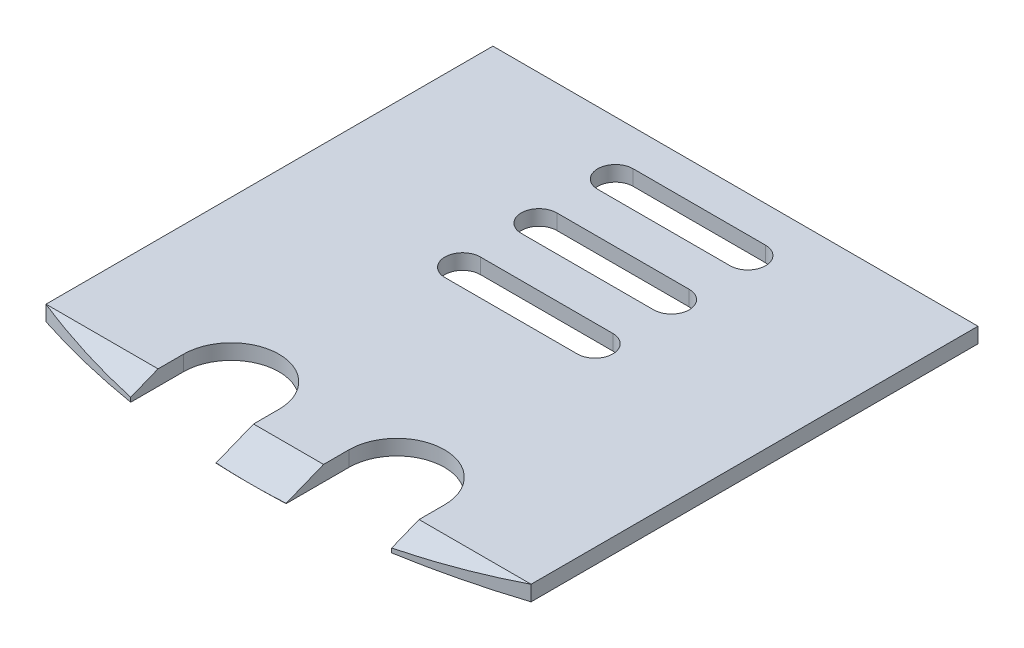
ISO-10303-21;
HEADER;
FILE_DESCRIPTION(('STEP AP214'),'2;1');
FILE_NAME('part.step','',(''),(''),'','','');
FILE_SCHEMA(('AUTOMOTIVE_DESIGN { 1 0 10303 214 1 1 1 1 }'));
ENDSEC;
DATA;
#1=APPLICATION_CONTEXT('core data for automotive mechanical design processes');
#2=APPLICATION_PROTOCOL_DEFINITION('international standard','automotive_design',2000,#1);
#3=PRODUCT_CONTEXT('',#1,'mechanical');
#4=PRODUCT('Part','Part','',(#3));
#5=PRODUCT_RELATED_PRODUCT_CATEGORY('part','',(#4));
#6=PRODUCT_DEFINITION_FORMATION('','',#4);
#7=PRODUCT_DEFINITION_CONTEXT('part definition',#1,'design');
#8=PRODUCT_DEFINITION('design','',#6,#7);
#9=PRODUCT_DEFINITION_SHAPE('','',#8);
#10=(LENGTH_UNIT() NAMED_UNIT(*) SI_UNIT(.MILLI.,.METRE.));
#11=(NAMED_UNIT(*) PLANE_ANGLE_UNIT() SI_UNIT($,.RADIAN.));
#12=(NAMED_UNIT(*) SI_UNIT($,.STERADIAN.) SOLID_ANGLE_UNIT());
#13=UNCERTAINTY_MEASURE_WITH_UNIT(LENGTH_MEASURE(1.E-05),#10,'distance_accuracy_value','');
#14=(GEOMETRIC_REPRESENTATION_CONTEXT(3) GLOBAL_UNCERTAINTY_ASSIGNED_CONTEXT((#13)) GLOBAL_UNIT_ASSIGNED_CONTEXT((#10,
#11,#12)) REPRESENTATION_CONTEXT('',''));
#15=CARTESIAN_POINT('',(0.,0.,0.));
#16=DIRECTION('',(0.,0.,1.));
#17=DIRECTION('',(1.,0.,0.));
#18=AXIS2_PLACEMENT_3D('',#15,#16,#17);
#19=CARTESIAN_POINT('',(0.,0.6,-21.466875));
#20=DIRECTION('',(0.,-1.,0.));
#21=DIRECTION('',(0.,0.,-1.));
#22=AXIS2_PLACEMENT_3D('',#19,#20,#21);
#23=CYLINDRICAL_SURFACE('',#22,30.991875);
#24=CARTESIAN_POINT('',(0.,0.,-21.466875));
#25=DIRECTION('',(0.,1.,0.));
#26=DIRECTION('',(0.,0.,1.));
#27=AXIS2_PLACEMENT_3D('',#24,#25,#26);
#28=CIRCLE('',#27,30.991875);
#29=CARTESIAN_POINT('',(-1.37500000000002,0.,9.49448302925357));
#30=VERTEX_POINT('',#29);
#31=CARTESIAN_POINT('',(0.,0.,9.525));
#32=VERTEX_POINT('',#31);
#33=EDGE_CURVE('E371',#30,#32,#28,.T.);
#34=ORIENTED_EDGE('',*,*,#33,.T.);
#35=CARTESIAN_POINT('',(0.,12.39675,-21.466875));
#36=DIRECTION('',(0.,-0.928476690885259,-0.371390676354104));
#37=DIRECTION('',(0.,-0.371390676354104,0.928476690885259));
#38=AXIS2_PLACEMENT_3D('',#35,#36,#37);
#39=ELLIPSE('',#38,33.3792709114223,30.991875);
#40=CARTESIAN_POINT('',(-1.37500000000002,0.0122067882985695,9.49448302925357));
#41=VERTEX_POINT('',#40);
#42=EDGE_CURVE('E324',#32,#41,#39,.T.);
#43=ORIENTED_EDGE('',*,*,#42,.T.);
#44=DIRECTION('',(0.,-1.,0.));
#45=VECTOR('',#44,1.);
#46=CARTESIAN_POINT('',(-1.37500000000002,0.6,9.49448302925357));
#47=LINE('',#46,#45);
#48=EDGE_CURVE('E404',#41,#30,#47,.T.);
#49=ORIENTED_EDGE('',*,*,#48,.T.);
#50=EDGE_LOOP('',(#34,#43,#49));
#51=FACE_BOUND('',#50,.T.);
#52=ADVANCED_FACE('F33',(#51),#23,.T.);
#53=CARTESIAN_POINT('',(-9.52500000000001,0.6,-9.525));
#54=DIRECTION('',(1.,0.,0.));
#55=DIRECTION('',(0.,0.,-1.));
#56=AXIS2_PLACEMENT_3D('',#53,#54,#55);
#57=PLANE('',#56);
#58=DIRECTION('',(0.,0.,1.));
#59=VECTOR('',#58,1.);
#60=CARTESIAN_POINT('',(-9.52500000000001,0.,-9.525));
#61=LINE('',#60,#59);
#62=CARTESIAN_POINT('',(-9.52500000000001,0.,-9.525));
#63=VERTEX_POINT('',#62);
#64=CARTESIAN_POINT('',(-9.525,0.,8.025));
#65=VERTEX_POINT('',#64);
#66=EDGE_CURVE('E334',#63,#65,#61,.T.);
#67=ORIENTED_EDGE('',*,*,#66,.T.);
#68=DIRECTION('',(0.,-1.,0.));
#69=VECTOR('',#68,1.);
#70=CARTESIAN_POINT('',(-9.525,0.6,8.025));
#71=LINE('',#70,#69);
#72=CARTESIAN_POINT('',(-9.52500000000001,0.6,8.025));
#73=VERTEX_POINT('',#72);
#74=EDGE_CURVE('E11',#73,#65,#71,.T.);
#75=ORIENTED_EDGE('',*,*,#74,.F.);
#76=DIRECTION('',(0.,0.,1.));
#77=VECTOR('',#76,1.);
#78=CARTESIAN_POINT('',(-9.52500000000001,0.6,-9.525));
#79=LINE('',#78,#77);
#80=CARTESIAN_POINT('',(-9.52500000000001,0.6,-9.525));
#81=VERTEX_POINT('',#80);
#82=EDGE_CURVE('E335',#81,#73,#79,.T.);
#83=ORIENTED_EDGE('',*,*,#82,.F.);
#84=DIRECTION('',(0.,-1.,0.));
#85=VECTOR('',#84,1.);
#86=CARTESIAN_POINT('',(-9.52500000000001,0.6,-9.525));
#87=LINE('',#86,#85);
#88=EDGE_CURVE('E357',#81,#63,#87,.T.);
#89=ORIENTED_EDGE('',*,*,#88,.T.);
#90=EDGE_LOOP('',(#67,#75,#83,#89));
#91=FACE_BOUND('',#90,.T.);
#92=ADVANCED_FACE('F35',(#91),#57,.F.);
#93=CARTESIAN_POINT('',(0.,0.6,-21.466875));
#94=DIRECTION('',(0.,-1.,0.));
#95=DIRECTION('',(0.,0.,-1.));
#96=AXIS2_PLACEMENT_3D('',#93,#94,#95);
#97=CYLINDRICAL_SURFACE('',#96,30.991875);
#98=DIRECTION('',(0.,-1.,0.));
#99=VECTOR('',#98,1.);
#100=CARTESIAN_POINT('',(-5.125,0.6,9.09831256715923));
#101=LINE('',#100,#99);
#102=CARTESIAN_POINT('',(-5.125,0.170674973136309,9.09831256715923));
#103=VERTEX_POINT('',#102);
#104=CARTESIAN_POINT('',(-5.125,0.,9.09831256715923));
#105=VERTEX_POINT('',#104);
#106=EDGE_CURVE('E41',#103,#105,#101,.T.);
#107=ORIENTED_EDGE('',*,*,#106,.F.);
#108=CARTESIAN_POINT('',(0.,12.39675,-21.466875));
#109=DIRECTION('',(0.,-0.928476690885259,-0.371390676354104));
#110=DIRECTION('',(0.,-0.371390676354104,0.928476690885259));
#111=AXIS2_PLACEMENT_3D('',#108,#109,#110);
#112=ELLIPSE('',#111,33.3792709114223,30.991875);
#113=EDGE_CURVE('E331',#103,#73,#112,.T.);
#114=ORIENTED_EDGE('',*,*,#113,.T.);
#115=ORIENTED_EDGE('',*,*,#74,.T.);
#116=CARTESIAN_POINT('',(0.,0.,-21.466875));
#117=DIRECTION('',(0.,1.,0.));
#118=DIRECTION('',(0.,0.,1.));
#119=AXIS2_PLACEMENT_3D('',#116,#117,#118);
#120=CIRCLE('',#119,30.991875);
#121=EDGE_CURVE('E360',#65,#105,#120,.T.);
#122=ORIENTED_EDGE('',*,*,#121,.T.);
#123=EDGE_LOOP('',(#107,#114,#115,#122));
#124=FACE_BOUND('',#123,.T.);
#125=ADVANCED_FACE('F418',(#124),#97,.T.);
#126=CARTESIAN_POINT('',(-5.125,0.6,7.025));
#127=DIRECTION('',(-1.,0.,0.));
#128=DIRECTION('',(0.,0.,1.));
#129=AXIS2_PLACEMENT_3D('',#126,#127,#128);
#130=PLANE('',#129);
#131=DIRECTION('',(0.,0.,-1.));
#132=VECTOR('',#131,1.);
#133=CARTESIAN_POINT('',(-5.125,0.6,7.025));
#134=LINE('',#133,#132);
#135=CARTESIAN_POINT('',(-5.125,0.6,8.025));
#136=VERTEX_POINT('',#135);
#137=CARTESIAN_POINT('',(-5.125,0.6,7.025));
#138=VERTEX_POINT('',#137);
#139=EDGE_CURVE('E338',#136,#138,#134,.T.);
#140=ORIENTED_EDGE('',*,*,#139,.F.);
#141=DIRECTION('',(0.,-0.371390676354104,0.928476690885259));
#142=VECTOR('',#141,1.);
#143=CARTESIAN_POINT('',(-5.125,0.944827586206897,7.16293103448276));
#144=LINE('',#143,#142);
#145=EDGE_CURVE('E328',#136,#103,#144,.T.);
#146=ORIENTED_EDGE('',*,*,#145,.T.);
#147=ORIENTED_EDGE('',*,*,#106,.T.);
#148=DIRECTION('',(0.,0.,-1.));
#149=VECTOR('',#148,1.);
#150=CARTESIAN_POINT('',(-5.125,0.,7.025));
#151=LINE('',#150,#149);
#152=CARTESIAN_POINT('',(-5.125,0.,7.025));
#153=VERTEX_POINT('',#152);
#154=EDGE_CURVE('E363',#105,#153,#151,.T.);
#155=ORIENTED_EDGE('',*,*,#154,.T.);
#156=DIRECTION('',(0.,-1.,0.));
#157=VECTOR('',#156,1.);
#158=CARTESIAN_POINT('',(-5.125,0.6,7.025));
#159=LINE('',#158,#157);
#160=EDGE_CURVE('E409',#138,#153,#159,.T.);
#161=ORIENTED_EDGE('',*,*,#160,.F.);
#162=EDGE_LOOP('',(#140,#146,#147,#155,#161));
#163=FACE_BOUND('',#162,.T.);
#164=ADVANCED_FACE('F414',(#163),#130,.F.);
#165=CARTESIAN_POINT('',(-3.25,0.6,7.025));
#166=DIRECTION('',(0.,-1.,0.));
#167=DIRECTION('',(0.,0.,-1.));
#168=AXIS2_PLACEMENT_3D('',#165,#166,#167);
#169=CYLINDRICAL_SURFACE('',#168,1.875);
#170=CARTESIAN_POINT('',(-3.25,0.,7.025));
#171=DIRECTION('',(0.,-1.,0.));
#172=DIRECTION('',(0.,0.,1.));
#173=AXIS2_PLACEMENT_3D('',#170,#171,#172);
#174=CIRCLE('',#173,1.875);
#175=CARTESIAN_POINT('',(-1.375,0.,7.025));
#176=VERTEX_POINT('',#175);
#177=EDGE_CURVE('E365',#153,#176,#174,.T.);
#178=ORIENTED_EDGE('',*,*,#177,.T.);
#179=DIRECTION('',(0.,-1.,0.));
#180=VECTOR('',#179,1.);
#181=CARTESIAN_POINT('',(-1.375,0.6,7.025));
#182=LINE('',#181,#180);
#183=CARTESIAN_POINT('',(-1.375,0.6,7.025));
#184=VERTEX_POINT('',#183);
#185=EDGE_CURVE('E406',#184,#176,#182,.T.);
#186=ORIENTED_EDGE('',*,*,#185,.F.);
#187=CARTESIAN_POINT('',(-3.25,0.6,7.025));
#188=DIRECTION('',(0.,-1.,0.));
#189=DIRECTION('',(0.,0.,1.));
#190=AXIS2_PLACEMENT_3D('',#187,#188,#189);
#191=CIRCLE('',#190,1.875);
#192=EDGE_CURVE('E341',#138,#184,#191,.T.);
#193=ORIENTED_EDGE('',*,*,#192,.F.);
#194=ORIENTED_EDGE('',*,*,#160,.T.);
#195=EDGE_LOOP('',(#178,#186,#193,#194));
#196=FACE_BOUND('',#195,.T.);
#197=ADVANCED_FACE('F427',(#196),#169,.F.);
#198=CARTESIAN_POINT('',(-1.375,0.6,7.025));
#199=DIRECTION('',(1.,0.,0.));
#200=DIRECTION('',(0.,0.,-1.));
#201=AXIS2_PLACEMENT_3D('',#198,#199,#200);
#202=PLANE('',#201);
#203=ORIENTED_EDGE('',*,*,#48,.F.);
#204=DIRECTION('',(0.,0.371390676354104,-0.928476690885259));
#205=VECTOR('',#204,1.);
#206=CARTESIAN_POINT('',(-1.375,0.944827586206897,7.16293103448276));
#207=LINE('',#206,#205);
#208=CARTESIAN_POINT('',(-1.37500000000001,0.6,8.025));
#209=VERTEX_POINT('',#208);
#210=EDGE_CURVE('E325',#41,#209,#207,.T.);
#211=ORIENTED_EDGE('',*,*,#210,.T.);
#212=DIRECTION('',(0.,0.,1.));
#213=VECTOR('',#212,1.);
#214=CARTESIAN_POINT('',(-1.375,0.6,7.025));
#215=LINE('',#214,#213);
#216=EDGE_CURVE('E343',#184,#209,#215,.T.);
#217=ORIENTED_EDGE('',*,*,#216,.F.);
#218=ORIENTED_EDGE('',*,*,#185,.T.);
#219=DIRECTION('',(0.,0.,1.));
#220=VECTOR('',#219,1.);
#221=CARTESIAN_POINT('',(-1.375,0.,7.025));
#222=LINE('',#221,#220);
#223=EDGE_CURVE('E367',#176,#30,#222,.T.);
#224=ORIENTED_EDGE('',*,*,#223,.T.);
#225=EDGE_LOOP('',(#203,#211,#217,#218,#224));
#226=FACE_BOUND('',#225,.T.);
#227=ADVANCED_FACE('F432',(#226),#202,.F.);
#228=DIRECTION('',(0.,-1.,0.));
#229=VECTOR('',#228,1.);
#230=CARTESIAN_POINT('',(1.375,0.6,9.49448302925358));
#231=LINE('',#230,#229);
#232=CARTESIAN_POINT('',(1.375,0.0122067882985691,9.49448302925358));
#233=VERTEX_POINT('',#232);
#234=CARTESIAN_POINT('',(1.375,0.,9.49448302925358));
#235=VERTEX_POINT('',#234);
#236=EDGE_CURVE('E402',#233,#235,#231,.T.);
#237=ORIENTED_EDGE('',*,*,#236,.F.);
#238=EDGE_CURVE('E321',#233,#32,#39,.T.);
#239=ORIENTED_EDGE('',*,*,#238,.T.);
#240=EDGE_CURVE('E370',#32,#235,#28,.T.);
#241=ORIENTED_EDGE('',*,*,#240,.T.);
#242=EDGE_LOOP('',(#237,#239,#241));
#243=FACE_BOUND('',#242,.T.);
#244=ADVANCED_FACE('F460',(#243),#23,.T.);
#245=CARTESIAN_POINT('',(1.375,0.6,7.025));
#246=DIRECTION('',(-1.,0.,0.));
#247=DIRECTION('',(0.,0.,1.));
#248=AXIS2_PLACEMENT_3D('',#245,#246,#247);
#249=PLANE('',#248);
#250=DIRECTION('',(0.,0.,-1.));
#251=VECTOR('',#250,1.);
#252=CARTESIAN_POINT('',(1.375,0.6,7.025));
#253=LINE('',#252,#251);
#254=CARTESIAN_POINT('',(1.375,0.6,8.025));
#255=VERTEX_POINT('',#254);
#256=CARTESIAN_POINT('',(1.375,0.6,7.025));
#257=VERTEX_POINT('',#256);
#258=EDGE_CURVE('E346',#255,#257,#253,.T.);
#259=ORIENTED_EDGE('',*,*,#258,.F.);
#260=DIRECTION('',(0.,-0.371390676354104,0.928476690885259));
#261=VECTOR('',#260,1.);
#262=CARTESIAN_POINT('',(1.375,0.944827586206897,7.16293103448276));
#263=LINE('',#262,#261);
#264=EDGE_CURVE('E318',#255,#233,#263,.T.);
#265=ORIENTED_EDGE('',*,*,#264,.T.);
#266=ORIENTED_EDGE('',*,*,#236,.T.);
#267=DIRECTION('',(0.,0.,-1.));
#268=VECTOR('',#267,1.);
#269=CARTESIAN_POINT('',(1.375,0.,7.025));
#270=LINE('',#269,#268);
#271=CARTESIAN_POINT('',(1.375,0.,7.025));
#272=VERTEX_POINT('',#271);
#273=EDGE_CURVE('E374',#235,#272,#270,.T.);
#274=ORIENTED_EDGE('',*,*,#273,.T.);
#275=DIRECTION('',(0.,-1.,0.));
#276=VECTOR('',#275,1.);
#277=CARTESIAN_POINT('',(1.375,0.6,7.025));
#278=LINE('',#277,#276);
#279=EDGE_CURVE('E399',#257,#272,#278,.T.);
#280=ORIENTED_EDGE('',*,*,#279,.F.);
#281=EDGE_LOOP('',(#259,#265,#266,#274,#280));
#282=FACE_BOUND('',#281,.T.);
#283=ADVANCED_FACE('F468',(#282),#249,.F.);
#284=CARTESIAN_POINT('',(3.25,0.6,7.025));
#285=DIRECTION('',(0.,-1.,0.));
#286=DIRECTION('',(0.,0.,-1.));
#287=AXIS2_PLACEMENT_3D('',#284,#285,#286);
#288=CYLINDRICAL_SURFACE('',#287,1.875);
#289=CARTESIAN_POINT('',(3.25,0.,7.025));
#290=DIRECTION('',(0.,-1.,0.));
#291=DIRECTION('',(0.,0.,1.));
#292=AXIS2_PLACEMENT_3D('',#289,#290,#291);
#293=CIRCLE('',#292,1.875);
#294=CARTESIAN_POINT('',(5.125,0.,7.025));
#295=VERTEX_POINT('',#294);
#296=EDGE_CURVE('E376',#272,#295,#293,.T.);
#297=ORIENTED_EDGE('',*,*,#296,.T.);
#298=DIRECTION('',(0.,-1.,0.));
#299=VECTOR('',#298,1.);
#300=CARTESIAN_POINT('',(5.125,0.6,7.025));
#301=LINE('',#300,#299);
#302=CARTESIAN_POINT('',(5.125,0.6,7.025));
#303=VERTEX_POINT('',#302);
#304=EDGE_CURVE('E396',#303,#295,#301,.T.);
#305=ORIENTED_EDGE('',*,*,#304,.F.);
#306=CARTESIAN_POINT('',(3.25,0.6,7.025));
#307=DIRECTION('',(0.,-1.,0.));
#308=DIRECTION('',(0.,0.,1.));
#309=AXIS2_PLACEMENT_3D('',#306,#307,#308);
#310=CIRCLE('',#309,1.875);
#311=EDGE_CURVE('E348',#257,#303,#310,.T.);
#312=ORIENTED_EDGE('',*,*,#311,.F.);
#313=ORIENTED_EDGE('',*,*,#279,.T.);
#314=EDGE_LOOP('',(#297,#305,#312,#313));
#315=FACE_BOUND('',#314,.T.);
#316=ADVANCED_FACE('F474',(#315),#288,.F.);
#317=CARTESIAN_POINT('',(5.125,0.6,7.025));
#318=DIRECTION('',(1.,0.,0.));
#319=DIRECTION('',(0.,0.,-1.));
#320=AXIS2_PLACEMENT_3D('',#317,#318,#319);
#321=PLANE('',#320);
#322=DIRECTION('',(0.,-1.,0.));
#323=VECTOR('',#322,1.);
#324=CARTESIAN_POINT('',(5.125,0.6,9.09831256715923));
#325=LINE('',#324,#323);
#326=CARTESIAN_POINT('',(5.125,0.170674973136309,9.09831256715923));
#327=VERTEX_POINT('',#326);
#328=CARTESIAN_POINT('',(5.125,0.,9.09831256715923));
#329=VERTEX_POINT('',#328);
#330=EDGE_CURVE('E394',#327,#329,#325,.T.);
#331=ORIENTED_EDGE('',*,*,#330,.F.);
#332=DIRECTION('',(0.,0.371390676354104,-0.928476690885259));
#333=VECTOR('',#332,1.);
#334=CARTESIAN_POINT('',(5.125,0.944827586206897,7.16293103448276));
#335=LINE('',#334,#333);
#336=CARTESIAN_POINT('',(5.12499999999999,0.6,8.025));
#337=VERTEX_POINT('',#336);
#338=EDGE_CURVE('E315',#327,#337,#335,.T.);
#339=ORIENTED_EDGE('',*,*,#338,.T.);
#340=DIRECTION('',(0.,0.,1.));
#341=VECTOR('',#340,1.);
#342=CARTESIAN_POINT('',(5.125,0.6,7.025));
#343=LINE('',#342,#341);
#344=EDGE_CURVE('E350',#303,#337,#343,.T.);
#345=ORIENTED_EDGE('',*,*,#344,.F.);
#346=ORIENTED_EDGE('',*,*,#304,.T.);
#347=DIRECTION('',(0.,0.,1.));
#348=VECTOR('',#347,1.);
#349=CARTESIAN_POINT('',(5.125,0.,7.025));
#350=LINE('',#349,#348);
#351=EDGE_CURVE('E378',#295,#329,#350,.T.);
#352=ORIENTED_EDGE('',*,*,#351,.T.);
#353=EDGE_LOOP('',(#331,#339,#345,#346,#352));
#354=FACE_BOUND('',#353,.T.);
#355=ADVANCED_FACE('F491',(#354),#321,.F.);
#356=CARTESIAN_POINT('',(0.,0.6,-21.466875));
#357=DIRECTION('',(0.,-1.,0.));
#358=DIRECTION('',(0.,0.,-1.));
#359=AXIS2_PLACEMENT_3D('',#356,#357,#358);
#360=CYLINDRICAL_SURFACE('',#359,30.991875);
#361=DIRECTION('',(0.,-1.,0.));
#362=VECTOR('',#361,1.);
#363=CARTESIAN_POINT('',(9.525,0.6,8.025));
#364=LINE('',#363,#362);
#365=CARTESIAN_POINT('',(9.525,0.6,8.025));
#366=VERTEX_POINT('',#365);
#367=CARTESIAN_POINT('',(9.525,0.,8.025));
#368=VERTEX_POINT('',#367);
#369=EDGE_CURVE('E391',#366,#368,#364,.T.);
#370=ORIENTED_EDGE('',*,*,#369,.F.);
#371=CARTESIAN_POINT('',(0.,12.39675,-21.466875));
#372=DIRECTION('',(0.,-0.928476690885259,-0.371390676354104));
#373=DIRECTION('',(0.,-0.371390676354104,0.928476690885259));
#374=AXIS2_PLACEMENT_3D('',#371,#372,#373);
#375=ELLIPSE('',#374,33.3792709114223,30.991875);
#376=EDGE_CURVE('E311',#366,#327,#375,.T.);
#377=ORIENTED_EDGE('',*,*,#376,.T.);
#378=ORIENTED_EDGE('',*,*,#330,.T.);
#379=CARTESIAN_POINT('',(0.,0.,-21.466875));
#380=DIRECTION('',(0.,1.,0.));
#381=DIRECTION('',(0.,0.,1.));
#382=AXIS2_PLACEMENT_3D('',#379,#380,#381);
#383=CIRCLE('',#382,30.991875);
#384=EDGE_CURVE('E381',#329,#368,#383,.T.);
#385=ORIENTED_EDGE('',*,*,#384,.T.);
#386=EDGE_LOOP('',(#370,#377,#378,#385));
#387=FACE_BOUND('',#386,.T.);
#388=ADVANCED_FACE('F496',(#387),#360,.T.);
#389=CARTESIAN_POINT('',(9.525,0.6,-9.525));
#390=DIRECTION('',(-1.,0.,0.));
#391=DIRECTION('',(0.,0.,1.));
#392=AXIS2_PLACEMENT_3D('',#389,#390,#391);
#393=PLANE('',#392);
#394=DIRECTION('',(0.,0.,-1.));
#395=VECTOR('',#394,1.);
#396=CARTESIAN_POINT('',(9.525,0.,-9.525));
#397=LINE('',#396,#395);
#398=CARTESIAN_POINT('',(9.525,0.,-9.525));
#399=VERTEX_POINT('',#398);
#400=EDGE_CURVE('E383',#368,#399,#397,.T.);
#401=ORIENTED_EDGE('',*,*,#400,.T.);
#402=DIRECTION('',(0.,-1.,0.));
#403=VECTOR('',#402,1.);
#404=CARTESIAN_POINT('',(9.525,0.6,-9.525));
#405=LINE('',#404,#403);
#406=CARTESIAN_POINT('',(9.525,0.6,-9.525));
#407=VERTEX_POINT('',#406);
#408=EDGE_CURVE('E388',#407,#399,#405,.T.);
#409=ORIENTED_EDGE('',*,*,#408,.F.);
#410=DIRECTION('',(0.,0.,-1.));
#411=VECTOR('',#410,1.);
#412=CARTESIAN_POINT('',(9.525,0.6,-9.525));
#413=LINE('',#412,#411);
#414=EDGE_CURVE('E353',#366,#407,#413,.T.);
#415=ORIENTED_EDGE('',*,*,#414,.F.);
#416=ORIENTED_EDGE('',*,*,#369,.T.);
#417=EDGE_LOOP('',(#401,#409,#415,#416));
#418=FACE_BOUND('',#417,.T.);
#419=ADVANCED_FACE('F499',(#418),#393,.F.);
#420=CARTESIAN_POINT('',(-9.52500000000001,0.6,-9.525));
#421=DIRECTION('',(0.,0.,1.));
#422=DIRECTION('',(1.,0.,0.));
#423=AXIS2_PLACEMENT_3D('',#420,#421,#422);
#424=PLANE('',#423);
#425=DIRECTION('',(-1.,0.,0.));
#426=VECTOR('',#425,1.);
#427=CARTESIAN_POINT('',(-9.52500000000001,0.,-9.525));
#428=LINE('',#427,#426);
#429=EDGE_CURVE('E339',#399,#63,#428,.T.);
#430=ORIENTED_EDGE('',*,*,#429,.T.);
#431=ORIENTED_EDGE('',*,*,#88,.F.);
#432=DIRECTION('',(-1.,0.,0.));
#433=VECTOR('',#432,1.);
#434=CARTESIAN_POINT('',(-9.52500000000001,0.6,-9.525));
#435=LINE('',#434,#433);
#436=EDGE_CURVE('E355',#407,#81,#435,.T.);
#437=ORIENTED_EDGE('',*,*,#436,.F.);
#438=ORIENTED_EDGE('',*,*,#408,.T.);
#439=EDGE_LOOP('',(#430,#431,#437,#438));
#440=FACE_BOUND('',#439,.T.);
#441=ADVANCED_FACE('F504',(#440),#424,.F.);
#442=CARTESIAN_POINT('',(0.,0.6,-21.466875));
#443=DIRECTION('',(0.,1.,0.));
#444=DIRECTION('',(0.,0.,1.));
#445=AXIS2_PLACEMENT_3D('',#442,#443,#444);
#446=PLANE('',#445);
#447=CARTESIAN_POINT('',(2.59929360029941,0.6,-1.41170003742515));
#448=DIRECTION('',(0.,1.,0.));
#449=DIRECTION('',(0.,0.,1.));
#450=AXIS2_PLACEMENT_3D('',#447,#448,#449);
#451=CIRCLE('',#450,0.698095995508982);
#452=CARTESIAN_POINT('',(2.59929360029941,0.6,-0.713604041916172));
#453=VERTEX_POINT('',#452);
#454=CARTESIAN_POINT('',(2.59929360029941,0.6,-2.10979603293414));
#455=VERTEX_POINT('',#454);
#456=EDGE_CURVE('E48',#453,#455,#451,.T.);
#457=ORIENTED_EDGE('',*,*,#456,.F.);
#458=DIRECTION('',(1.,0.,0.));
#459=VECTOR('',#458,1.);
#460=CARTESIAN_POINT('',(2.59929360029941,0.6,-0.713604041916172));
#461=LINE('',#460,#459);
#462=CARTESIAN_POINT('',(-2.59929360029941,0.6,-0.713604041916172));
#463=VERTEX_POINT('',#462);
#464=EDGE_CURVE('E217',#463,#453,#461,.T.);
#465=ORIENTED_EDGE('',*,*,#464,.F.);
#466=CARTESIAN_POINT('',(-2.59929360029941,0.6,-1.41170003742515));
#467=DIRECTION('',(0.,1.,0.));
#468=DIRECTION('',(0.,0.,1.));
#469=AXIS2_PLACEMENT_3D('',#466,#467,#468);
#470=CIRCLE('',#469,0.698095995508982);
#471=CARTESIAN_POINT('',(-2.59929360029941,0.6,-2.10979603293414));
#472=VERTEX_POINT('',#471);
#473=EDGE_CURVE('E237',#472,#463,#470,.T.);
#474=ORIENTED_EDGE('',*,*,#473,.F.);
#475=DIRECTION('',(-1.,0.,0.));
#476=VECTOR('',#475,1.);
#477=CARTESIAN_POINT('',(2.59929360029941,0.6,-2.10979603293414));
#478=LINE('',#477,#476);
#479=EDGE_CURVE('E231',#455,#472,#478,.T.);
#480=ORIENTED_EDGE('',*,*,#479,.F.);
#481=EDGE_LOOP('',(#457,#465,#474,#480));
#482=FACE_BOUND('',#481,.T.);
#483=CARTESIAN_POINT('',(2.59929360029941,0.6,-4.41170003742515));
#484=DIRECTION('',(0.,1.,0.));
#485=DIRECTION('',(0.,0.,1.));
#486=AXIS2_PLACEMENT_3D('',#483,#484,#485);
#487=CIRCLE('',#486,0.698095995508982);
#488=CARTESIAN_POINT('',(2.59929360029941,0.6,-3.71360404191617));
#489=VERTEX_POINT('',#488);
#490=CARTESIAN_POINT('',(2.59929360029941,0.6,-5.10979603293413));
#491=VERTEX_POINT('',#490);
#492=EDGE_CURVE('E253',#489,#491,#487,.T.);
#493=ORIENTED_EDGE('',*,*,#492,.F.);
#494=DIRECTION('',(1.,0.,0.));
#495=VECTOR('',#494,1.);
#496=CARTESIAN_POINT('',(2.59929360029941,0.6,-3.71360404191617));
#497=LINE('',#496,#495);
#498=CARTESIAN_POINT('',(-2.59929360029941,0.6,-3.71360404191617));
#499=VERTEX_POINT('',#498);
#500=EDGE_CURVE('E261',#499,#489,#497,.T.);
#501=ORIENTED_EDGE('',*,*,#500,.F.);
#502=CARTESIAN_POINT('',(-2.59929360029941,0.6,-4.41170003742515));
#503=DIRECTION('',(0.,1.,0.));
#504=DIRECTION('',(0.,0.,1.));
#505=AXIS2_PLACEMENT_3D('',#502,#503,#504);
#506=CIRCLE('',#505,0.698095995508982);
#507=CARTESIAN_POINT('',(-2.59929360029941,0.6,-5.10979603293414));
#508=VERTEX_POINT('',#507);
#509=EDGE_CURVE('E258',#508,#499,#506,.T.);
#510=ORIENTED_EDGE('',*,*,#509,.F.);
#511=DIRECTION('',(-1.,0.,0.));
#512=VECTOR('',#511,1.);
#513=CARTESIAN_POINT('',(2.59929360029941,0.6,-5.10979603293414));
#514=LINE('',#513,#512);
#515=EDGE_CURVE('E255',#491,#508,#514,.T.);
#516=ORIENTED_EDGE('',*,*,#515,.F.);
#517=EDGE_LOOP('',(#493,#501,#510,#516));
#518=FACE_BOUND('',#517,.T.);
#519=CARTESIAN_POINT('',(2.59929360029941,0.6,-7.41170003742515));
#520=DIRECTION('',(0.,1.,0.));
#521=DIRECTION('',(0.,0.,1.));
#522=AXIS2_PLACEMENT_3D('',#519,#520,#521);
#523=CIRCLE('',#522,0.698095995508982);
#524=CARTESIAN_POINT('',(2.59929360029941,0.6,-6.71360404191617));
#525=VERTEX_POINT('',#524);
#526=CARTESIAN_POINT('',(2.59929360029941,0.6,-8.10979603293413));
#527=VERTEX_POINT('',#526);
#528=EDGE_CURVE('E284',#525,#527,#523,.T.);
#529=ORIENTED_EDGE('',*,*,#528,.F.);
#530=DIRECTION('',(1.,0.,0.));
#531=VECTOR('',#530,1.);
#532=CARTESIAN_POINT('',(2.59929360029941,0.6,-6.71360404191617));
#533=LINE('',#532,#531);
#534=CARTESIAN_POINT('',(-2.59929360029941,0.6,-6.71360404191617));
#535=VERTEX_POINT('',#534);
#536=EDGE_CURVE('E292',#535,#525,#533,.T.);
#537=ORIENTED_EDGE('',*,*,#536,.F.);
#538=CARTESIAN_POINT('',(-2.59929360029941,0.6,-7.41170003742515));
#539=DIRECTION('',(0.,1.,0.));
#540=DIRECTION('',(0.,0.,1.));
#541=AXIS2_PLACEMENT_3D('',#538,#539,#540);
#542=CIRCLE('',#541,0.698095995508982);
#543=CARTESIAN_POINT('',(-2.59929360029941,0.6,-8.10979603293413));
#544=VERTEX_POINT('',#543);
#545=EDGE_CURVE('E289',#544,#535,#542,.T.);
#546=ORIENTED_EDGE('',*,*,#545,.F.);
#547=DIRECTION('',(-1.,0.,0.));
#548=VECTOR('',#547,1.);
#549=CARTESIAN_POINT('',(2.59929360029941,0.6,-8.10979603293413));
#550=LINE('',#549,#548);
#551=EDGE_CURVE('E286',#527,#544,#550,.T.);
#552=ORIENTED_EDGE('',*,*,#551,.F.);
#553=EDGE_LOOP('',(#529,#537,#546,#552));
#554=FACE_BOUND('',#553,.T.);
#555=DIRECTION('',(1.,0.,0.));
#556=VECTOR('',#555,1.);
#557=CARTESIAN_POINT('',(-9.52500000000001,0.6,8.025));
#558=LINE('',#557,#556);
#559=EDGE_CURVE('E307',#337,#366,#558,.T.);
#560=ORIENTED_EDGE('',*,*,#559,.T.);
#561=ORIENTED_EDGE('',*,*,#414,.T.);
#562=ORIENTED_EDGE('',*,*,#436,.T.);
#563=ORIENTED_EDGE('',*,*,#82,.T.);
#564=EDGE_CURVE('E308',#73,#136,#558,.T.);
#565=ORIENTED_EDGE('',*,*,#564,.T.);
#566=ORIENTED_EDGE('',*,*,#139,.T.);
#567=ORIENTED_EDGE('',*,*,#192,.T.);
#568=ORIENTED_EDGE('',*,*,#216,.T.);
#569=EDGE_CURVE('E312',#209,#255,#558,.T.);
#570=ORIENTED_EDGE('',*,*,#569,.T.);
#571=ORIENTED_EDGE('',*,*,#258,.T.);
#572=ORIENTED_EDGE('',*,*,#311,.T.);
#573=ORIENTED_EDGE('',*,*,#344,.T.);
#574=EDGE_LOOP('',(#560,#561,#562,#563,#565,#566,#567,#568,#570,#571,#572,#573));
#575=FACE_BOUND('',#574,.T.);
#576=ADVANCED_FACE('F436',(#482,#518,#554,#575),#446,.T.);
#577=CARTESIAN_POINT('',(0.,0.,-21.466875));
#578=DIRECTION('',(0.,1.,0.));
#579=DIRECTION('',(0.,0.,1.));
#580=AXIS2_PLACEMENT_3D('',#577,#578,#579);
#581=PLANE('',#580);
#582=DIRECTION('',(-1.,0.,0.));
#583=VECTOR('',#582,1.);
#584=CARTESIAN_POINT('',(2.59929360029941,0.,-0.713604041916172));
#585=LINE('',#584,#583);
#586=CARTESIAN_POINT('',(2.59929360029941,0.,-0.713604041916172));
#587=VERTEX_POINT('',#586);
#588=CARTESIAN_POINT('',(-2.59929360029941,0.,-0.713604041916172));
#589=VERTEX_POINT('',#588);
#590=EDGE_CURVE('E229',#587,#589,#585,.T.);
#591=ORIENTED_EDGE('',*,*,#590,.F.);
#592=CARTESIAN_POINT('',(2.59929360029941,0.,-1.41170003742515));
#593=DIRECTION('',(0.,1.,0.));
#594=DIRECTION('',(0.,0.,1.));
#595=AXIS2_PLACEMENT_3D('',#592,#593,#594);
#596=CIRCLE('',#595,0.698095995508982);
#597=CARTESIAN_POINT('',(2.59929360029941,0.,-2.10979603293414));
#598=VERTEX_POINT('',#597);
#599=EDGE_CURVE('E211',#598,#587,#596,.F.);
#600=ORIENTED_EDGE('',*,*,#599,.F.);
#601=DIRECTION('',(1.,0.,0.));
#602=VECTOR('',#601,1.);
#603=CARTESIAN_POINT('',(2.59929360029941,0.,-2.10979603293414));
#604=LINE('',#603,#602);
#605=CARTESIAN_POINT('',(-2.59929360029941,0.,-2.10979603293414));
#606=VERTEX_POINT('',#605);
#607=EDGE_CURVE('E220',#606,#598,#604,.T.);
#608=ORIENTED_EDGE('',*,*,#607,.F.);
#609=CARTESIAN_POINT('',(-2.59929360029941,0.,-1.41170003742515));
#610=DIRECTION('',(0.,1.,0.));
#611=DIRECTION('',(0.,0.,1.));
#612=AXIS2_PLACEMENT_3D('',#609,#610,#611);
#613=CIRCLE('',#612,0.698095995508982);
#614=EDGE_CURVE('E56',#589,#606,#613,.F.);
#615=ORIENTED_EDGE('',*,*,#614,.F.);
#616=EDGE_LOOP('',(#591,#600,#608,#615));
#617=FACE_BOUND('',#616,.T.);
#618=DIRECTION('',(-1.,0.,0.));
#619=VECTOR('',#618,1.);
#620=CARTESIAN_POINT('',(2.59929360029941,0.,-3.71360404191617));
#621=LINE('',#620,#619);
#622=CARTESIAN_POINT('',(2.59929360029941,0.,-3.71360404191617));
#623=VERTEX_POINT('',#622);
#624=CARTESIAN_POINT('',(-2.59929360029941,0.,-3.71360404191617));
#625=VERTEX_POINT('',#624);
#626=EDGE_CURVE('E247',#623,#625,#621,.T.);
#627=ORIENTED_EDGE('',*,*,#626,.F.);
#628=CARTESIAN_POINT('',(2.59929360029941,0.,-4.41170003742515));
#629=DIRECTION('',(0.,1.,0.));
#630=DIRECTION('',(0.,0.,1.));
#631=AXIS2_PLACEMENT_3D('',#628,#629,#630);
#632=CIRCLE('',#631,0.698095995508982);
#633=CARTESIAN_POINT('',(2.59929360029941,0.,-5.10979603293414));
#634=VERTEX_POINT('',#633);
#635=EDGE_CURVE('E250',#634,#623,#632,.F.);
#636=ORIENTED_EDGE('',*,*,#635,.F.);
#637=DIRECTION('',(1.,0.,0.));
#638=VECTOR('',#637,1.);
#639=CARTESIAN_POINT('',(2.59929360029941,0.,-5.10979603293414));
#640=LINE('',#639,#638);
#641=CARTESIAN_POINT('',(-2.59929360029941,0.,-5.10979603293413));
#642=VERTEX_POINT('',#641);
#643=EDGE_CURVE('E267',#642,#634,#640,.T.);
#644=ORIENTED_EDGE('',*,*,#643,.F.);
#645=CARTESIAN_POINT('',(-2.59929360029941,0.,-4.41170003742515));
#646=DIRECTION('',(0.,1.,0.));
#647=DIRECTION('',(0.,0.,1.));
#648=AXIS2_PLACEMENT_3D('',#645,#646,#647);
#649=CIRCLE('',#648,0.698095995508982);
#650=EDGE_CURVE('E223',#625,#642,#649,.F.);
#651=ORIENTED_EDGE('',*,*,#650,.F.);
#652=EDGE_LOOP('',(#627,#636,#644,#651));
#653=FACE_BOUND('',#652,.T.);
#654=DIRECTION('',(-1.,0.,0.));
#655=VECTOR('',#654,1.);
#656=CARTESIAN_POINT('',(2.59929360029941,0.,-6.71360404191617));
#657=LINE('',#656,#655);
#658=CARTESIAN_POINT('',(2.59929360029941,0.,-6.71360404191617));
#659=VERTEX_POINT('',#658);
#660=CARTESIAN_POINT('',(-2.59929360029941,0.,-6.71360404191617));
#661=VERTEX_POINT('',#660);
#662=EDGE_CURVE('E278',#659,#661,#657,.T.);
#663=ORIENTED_EDGE('',*,*,#662,.F.);
#664=CARTESIAN_POINT('',(2.59929360029941,0.,-7.41170003742515));
#665=DIRECTION('',(0.,1.,0.));
#666=DIRECTION('',(0.,0.,1.));
#667=AXIS2_PLACEMENT_3D('',#664,#665,#666);
#668=CIRCLE('',#667,0.698095995508982);
#669=CARTESIAN_POINT('',(2.59929360029941,0.,-8.10979603293413));
#670=VERTEX_POINT('',#669);
#671=EDGE_CURVE('E281',#670,#659,#668,.F.);
#672=ORIENTED_EDGE('',*,*,#671,.F.);
#673=DIRECTION('',(1.,0.,0.));
#674=VECTOR('',#673,1.);
#675=CARTESIAN_POINT('',(2.59929360029941,0.,-8.10979603293413));
#676=LINE('',#675,#674);
#677=CARTESIAN_POINT('',(-2.59929360029941,0.,-8.10979603293413));
#678=VERTEX_POINT('',#677);
#679=EDGE_CURVE('E298',#678,#670,#676,.T.);
#680=ORIENTED_EDGE('',*,*,#679,.F.);
#681=CARTESIAN_POINT('',(-2.59929360029941,0.,-7.41170003742515));
#682=DIRECTION('',(0.,1.,0.));
#683=DIRECTION('',(0.,0.,1.));
#684=AXIS2_PLACEMENT_3D('',#681,#682,#683);
#685=CIRCLE('',#684,0.698095995508982);
#686=EDGE_CURVE('E276',#661,#678,#685,.F.);
#687=ORIENTED_EDGE('',*,*,#686,.F.);
#688=EDGE_LOOP('',(#663,#672,#680,#687));
#689=FACE_BOUND('',#688,.T.);
#690=ORIENTED_EDGE('',*,*,#66,.F.);
#691=ORIENTED_EDGE('',*,*,#429,.F.);
#692=ORIENTED_EDGE('',*,*,#400,.F.);
#693=ORIENTED_EDGE('',*,*,#384,.F.);
#694=ORIENTED_EDGE('',*,*,#351,.F.);
#695=ORIENTED_EDGE('',*,*,#296,.F.);
#696=ORIENTED_EDGE('',*,*,#273,.F.);
#697=ORIENTED_EDGE('',*,*,#240,.F.);
#698=ORIENTED_EDGE('',*,*,#33,.F.);
#699=ORIENTED_EDGE('',*,*,#223,.F.);
#700=ORIENTED_EDGE('',*,*,#177,.F.);
#701=ORIENTED_EDGE('',*,*,#154,.F.);
#702=ORIENTED_EDGE('',*,*,#121,.F.);
#703=EDGE_LOOP('',(#690,#691,#692,#693,#694,#695,#696,#697,#698,#699,#700,#701,#702));
#704=FACE_BOUND('',#703,.T.);
#705=ADVANCED_FACE('F226',(#617,#653,#689,#704),#581,.F.);
#706=CARTESIAN_POINT('',(-9.52500000000001,0.,9.525));
#707=DIRECTION('',(0.,-0.928476690885259,-0.371390676354104));
#708=DIRECTION('',(0.,0.371390676354104,-0.928476690885259));
#709=AXIS2_PLACEMENT_3D('',#706,#707,#708);
#710=PLANE('',#709);
#711=ORIENTED_EDGE('',*,*,#145,.F.);
#712=ORIENTED_EDGE('',*,*,#564,.F.);
#713=ORIENTED_EDGE('',*,*,#113,.F.);
#714=EDGE_LOOP('',(#711,#712,#713));
#715=FACE_BOUND('',#714,.T.);
#716=ADVANCED_FACE('F440',(#715),#710,.F.);
#717=ORIENTED_EDGE('',*,*,#42,.F.);
#718=ORIENTED_EDGE('',*,*,#238,.F.);
#719=ORIENTED_EDGE('',*,*,#264,.F.);
#720=ORIENTED_EDGE('',*,*,#569,.F.);
#721=ORIENTED_EDGE('',*,*,#210,.F.);
#722=EDGE_LOOP('',(#717,#718,#719,#720,#721));
#723=FACE_BOUND('',#722,.T.);
#724=ADVANCED_FACE('F442',(#723),#710,.F.);
#725=ORIENTED_EDGE('',*,*,#376,.F.);
#726=ORIENTED_EDGE('',*,*,#559,.F.);
#727=ORIENTED_EDGE('',*,*,#338,.F.);
#728=EDGE_LOOP('',(#725,#726,#727));
#729=FACE_BOUND('',#728,.T.);
#730=ADVANCED_FACE('F444',(#729),#710,.F.);
#731=CARTESIAN_POINT('',(2.59929360029941,-0.00100000000000002,-7.41170003742515));
#732=DIRECTION('',(0.,1.,0.));
#733=DIRECTION('',(0.,0.,1.));
#734=AXIS2_PLACEMENT_3D('',#731,#732,#733);
#735=CYLINDRICAL_SURFACE('',#734,0.698095995508982);
#736=ORIENTED_EDGE('',*,*,#671,.T.);
#737=DIRECTION('',(0.,1.,0.));
#738=VECTOR('',#737,1.);
#739=CARTESIAN_POINT('',(2.59929360029941,-0.00100000000000002,-6.71360404191617));
#740=LINE('',#739,#738);
#741=EDGE_CURVE('E296',#659,#525,#740,.T.);
#742=ORIENTED_EDGE('',*,*,#741,.T.);
#743=ORIENTED_EDGE('',*,*,#528,.T.);
#744=DIRECTION('',(0.,1.,0.));
#745=VECTOR('',#744,1.);
#746=CARTESIAN_POINT('',(2.59929360029941,-0.00100000000000002,-8.10979603293413));
#747=LINE('',#746,#745);
#748=EDGE_CURVE('E295',#670,#527,#747,.T.);
#749=ORIENTED_EDGE('',*,*,#748,.F.);
#750=EDGE_LOOP('',(#736,#742,#743,#749));
#751=FACE_BOUND('',#750,.T.);
#752=ADVANCED_FACE('F455',(#751),#735,.F.);
#753=CARTESIAN_POINT('',(2.59929360029941,-0.00100000000000002,-6.71360404191617));
#754=DIRECTION('',(0.,0.,1.));
#755=DIRECTION('',(1.,0.,0.));
#756=AXIS2_PLACEMENT_3D('',#753,#754,#755);
#757=PLANE('',#756);
#758=ORIENTED_EDGE('',*,*,#662,.T.);
#759=DIRECTION('',(0.,1.,0.));
#760=VECTOR('',#759,1.);
#761=CARTESIAN_POINT('',(-2.59929360029941,-0.00100000000000002,-6.71360404191617));
#762=LINE('',#761,#760);
#763=EDGE_CURVE('E299',#661,#535,#762,.T.);
#764=ORIENTED_EDGE('',*,*,#763,.T.);
#765=ORIENTED_EDGE('',*,*,#536,.T.);
#766=ORIENTED_EDGE('',*,*,#741,.F.);
#767=EDGE_LOOP('',(#758,#764,#765,#766));
#768=FACE_BOUND('',#767,.T.);
#769=ADVANCED_FACE('F570',(#768),#757,.F.);
#770=CARTESIAN_POINT('',(-2.59929360029941,-0.00100000000000002,-7.41170003742515));
#771=DIRECTION('',(0.,1.,0.));
#772=DIRECTION('',(0.,0.,1.));
#773=AXIS2_PLACEMENT_3D('',#770,#771,#772);
#774=CYLINDRICAL_SURFACE('',#773,0.698095995508982);
#775=ORIENTED_EDGE('',*,*,#686,.T.);
#776=DIRECTION('',(0.,1.,0.));
#777=VECTOR('',#776,1.);
#778=CARTESIAN_POINT('',(-2.59929360029941,-0.00100000000000002,-8.10979603293413));
#779=LINE('',#778,#777);
#780=EDGE_CURVE('E301',#678,#544,#779,.T.);
#781=ORIENTED_EDGE('',*,*,#780,.T.);
#782=ORIENTED_EDGE('',*,*,#545,.T.);
#783=ORIENTED_EDGE('',*,*,#763,.F.);
#784=EDGE_LOOP('',(#775,#781,#782,#783));
#785=FACE_BOUND('',#784,.T.);
#786=ADVANCED_FACE('F579',(#785),#774,.F.);
#787=CARTESIAN_POINT('',(2.59929360029941,-0.00100000000000002,-8.10979603293413));
#788=DIRECTION('',(0.,0.,-1.));
#789=DIRECTION('',(-1.,0.,0.));
#790=AXIS2_PLACEMENT_3D('',#787,#788,#789);
#791=PLANE('',#790);
#792=ORIENTED_EDGE('',*,*,#679,.T.);
#793=ORIENTED_EDGE('',*,*,#748,.T.);
#794=ORIENTED_EDGE('',*,*,#551,.T.);
#795=ORIENTED_EDGE('',*,*,#780,.F.);
#796=EDGE_LOOP('',(#792,#793,#794,#795));
#797=FACE_BOUND('',#796,.T.);
#798=ADVANCED_FACE('F589',(#797),#791,.F.);
#799=CARTESIAN_POINT('',(2.59929360029941,-0.00100000000000002,-4.41170003742515));
#800=DIRECTION('',(0.,1.,0.));
#801=DIRECTION('',(0.,0.,1.));
#802=AXIS2_PLACEMENT_3D('',#799,#800,#801);
#803=CYLINDRICAL_SURFACE('',#802,0.698095995508982);
#804=ORIENTED_EDGE('',*,*,#635,.T.);
#805=DIRECTION('',(0.,1.,0.));
#806=VECTOR('',#805,1.);
#807=CARTESIAN_POINT('',(2.59929360029941,-0.00100000000000002,-3.71360404191617));
#808=LINE('',#807,#806);
#809=EDGE_CURVE('E265',#623,#489,#808,.T.);
#810=ORIENTED_EDGE('',*,*,#809,.T.);
#811=ORIENTED_EDGE('',*,*,#492,.T.);
#812=DIRECTION('',(0.,1.,0.));
#813=VECTOR('',#812,1.);
#814=CARTESIAN_POINT('',(2.59929360029941,-0.00100000000000002,-5.10979603293414));
#815=LINE('',#814,#813);
#816=EDGE_CURVE('E264',#634,#491,#815,.T.);
#817=ORIENTED_EDGE('',*,*,#816,.F.);
#818=EDGE_LOOP('',(#804,#810,#811,#817));
#819=FACE_BOUND('',#818,.T.);
#820=ADVANCED_FACE('F599',(#819),#803,.F.);
#821=CARTESIAN_POINT('',(2.59929360029941,-0.00100000000000002,-3.71360404191617));
#822=DIRECTION('',(0.,0.,1.));
#823=DIRECTION('',(1.,0.,0.));
#824=AXIS2_PLACEMENT_3D('',#821,#822,#823);
#825=PLANE('',#824);
#826=ORIENTED_EDGE('',*,*,#626,.T.);
#827=DIRECTION('',(0.,1.,0.));
#828=VECTOR('',#827,1.);
#829=CARTESIAN_POINT('',(-2.59929360029941,-0.00100000000000002,-3.71360404191617));
#830=LINE('',#829,#828);
#831=EDGE_CURVE('E268',#625,#499,#830,.T.);
#832=ORIENTED_EDGE('',*,*,#831,.T.);
#833=ORIENTED_EDGE('',*,*,#500,.T.);
#834=ORIENTED_EDGE('',*,*,#809,.F.);
#835=EDGE_LOOP('',(#826,#832,#833,#834));
#836=FACE_BOUND('',#835,.T.);
#837=ADVANCED_FACE('F609',(#836),#825,.F.);
#838=CARTESIAN_POINT('',(-2.59929360029941,-0.00100000000000002,-4.41170003742515));
#839=DIRECTION('',(0.,1.,0.));
#840=DIRECTION('',(0.,0.,1.));
#841=AXIS2_PLACEMENT_3D('',#838,#839,#840);
#842=CYLINDRICAL_SURFACE('',#841,0.698095995508982);
#843=ORIENTED_EDGE('',*,*,#650,.T.);
#844=DIRECTION('',(0.,1.,0.));
#845=VECTOR('',#844,1.);
#846=CARTESIAN_POINT('',(-2.59929360029941,-0.00100000000000002,-5.10979603293414));
#847=LINE('',#846,#845);
#848=EDGE_CURVE('E270',#642,#508,#847,.T.);
#849=ORIENTED_EDGE('',*,*,#848,.T.);
#850=ORIENTED_EDGE('',*,*,#509,.T.);
#851=ORIENTED_EDGE('',*,*,#831,.F.);
#852=EDGE_LOOP('',(#843,#849,#850,#851));
#853=FACE_BOUND('',#852,.T.);
#854=ADVANCED_FACE('F619',(#853),#842,.F.);
#855=CARTESIAN_POINT('',(2.59929360029941,-0.00100000000000002,-5.10979603293414));
#856=DIRECTION('',(0.,0.,-1.));
#857=DIRECTION('',(-1.,0.,0.));
#858=AXIS2_PLACEMENT_3D('',#855,#856,#857);
#859=PLANE('',#858);
#860=ORIENTED_EDGE('',*,*,#643,.T.);
#861=ORIENTED_EDGE('',*,*,#816,.T.);
#862=ORIENTED_EDGE('',*,*,#515,.T.);
#863=ORIENTED_EDGE('',*,*,#848,.F.);
#864=EDGE_LOOP('',(#860,#861,#862,#863));
#865=FACE_BOUND('',#864,.T.);
#866=ADVANCED_FACE('F629',(#865),#859,.F.);
#867=CARTESIAN_POINT('',(2.59929360029941,-0.00100000000000002,-1.41170003742515));
#868=DIRECTION('',(0.,1.,0.));
#869=DIRECTION('',(0.,0.,1.));
#870=AXIS2_PLACEMENT_3D('',#867,#868,#869);
#871=CYLINDRICAL_SURFACE('',#870,0.698095995508982);
#872=ORIENTED_EDGE('',*,*,#599,.T.);
#873=DIRECTION('',(0.,1.,0.));
#874=VECTOR('',#873,1.);
#875=CARTESIAN_POINT('',(2.59929360029941,-0.00100000000000002,-0.713604041916172));
#876=LINE('',#875,#874);
#877=EDGE_CURVE('E224',#587,#453,#876,.T.);
#878=ORIENTED_EDGE('',*,*,#877,.T.);
#879=ORIENTED_EDGE('',*,*,#456,.T.);
#880=DIRECTION('',(0.,1.,0.));
#881=VECTOR('',#880,1.);
#882=CARTESIAN_POINT('',(2.59929360029941,-0.00100000000000002,-2.10979603293414));
#883=LINE('',#882,#881);
#884=EDGE_CURVE('E207',#598,#455,#883,.T.);
#885=ORIENTED_EDGE('',*,*,#884,.F.);
#886=EDGE_LOOP('',(#872,#878,#879,#885));
#887=FACE_BOUND('',#886,.T.);
#888=ADVANCED_FACE('F209',(#887),#871,.F.);
#889=CARTESIAN_POINT('',(2.59929360029941,-0.00100000000000002,-0.713604041916172));
#890=DIRECTION('',(0.,0.,1.));
#891=DIRECTION('',(1.,0.,0.));
#892=AXIS2_PLACEMENT_3D('',#889,#890,#891);
#893=PLANE('',#892);
#894=ORIENTED_EDGE('',*,*,#590,.T.);
#895=DIRECTION('',(0.,1.,0.));
#896=VECTOR('',#895,1.);
#897=CARTESIAN_POINT('',(-2.59929360029941,-0.00100000000000002,-0.713604041916172));
#898=LINE('',#897,#896);
#899=EDGE_CURVE('E243',#589,#463,#898,.T.);
#900=ORIENTED_EDGE('',*,*,#899,.T.);
#901=ORIENTED_EDGE('',*,*,#464,.T.);
#902=ORIENTED_EDGE('',*,*,#877,.F.);
#903=EDGE_LOOP('',(#894,#900,#901,#902));
#904=FACE_BOUND('',#903,.T.);
#905=ADVANCED_FACE('F648',(#904),#893,.F.);
#906=CARTESIAN_POINT('',(-2.59929360029941,-0.00100000000000002,-1.41170003742515));
#907=DIRECTION('',(0.,1.,0.));
#908=DIRECTION('',(0.,0.,1.));
#909=AXIS2_PLACEMENT_3D('',#906,#907,#908);
#910=CYLINDRICAL_SURFACE('',#909,0.698095995508982);
#911=ORIENTED_EDGE('',*,*,#614,.T.);
#912=DIRECTION('',(0.,1.,0.));
#913=VECTOR('',#912,1.);
#914=CARTESIAN_POINT('',(-2.59929360029941,-0.00100000000000002,-2.10979603293414));
#915=LINE('',#914,#913);
#916=EDGE_CURVE('E216',#606,#472,#915,.T.);
#917=ORIENTED_EDGE('',*,*,#916,.T.);
#918=ORIENTED_EDGE('',*,*,#473,.T.);
#919=ORIENTED_EDGE('',*,*,#899,.F.);
#920=EDGE_LOOP('',(#911,#917,#918,#919));
#921=FACE_BOUND('',#920,.T.);
#922=ADVANCED_FACE('F657',(#921),#910,.F.);
#923=CARTESIAN_POINT('',(2.59929360029941,-0.00100000000000002,-2.10979603293414));
#924=DIRECTION('',(0.,0.,-1.));
#925=DIRECTION('',(-1.,0.,0.));
#926=AXIS2_PLACEMENT_3D('',#923,#924,#925);
#927=PLANE('',#926);
#928=ORIENTED_EDGE('',*,*,#607,.T.);
#929=ORIENTED_EDGE('',*,*,#884,.T.);
#930=ORIENTED_EDGE('',*,*,#479,.T.);
#931=ORIENTED_EDGE('',*,*,#916,.F.);
#932=EDGE_LOOP('',(#928,#929,#930,#931));
#933=FACE_BOUND('',#932,.T.);
#934=ADVANCED_FACE('F221',(#933),#927,.F.);
#935=CLOSED_SHELL('',(#52,#92,#125,#164,#197,#227,#244,#283,#316,#355,#388,#419,#441,#576,#705,
#716,#724,#730,#752,#769,#786,#798,#820,#837,#854,#866,#888,#905,#922,#934));
#936=MANIFOLD_SOLID_BREP('B2',#935);
#937=ADVANCED_BREP_SHAPE_REPRESENTATION('',(#18,#936),#14);
#938=SHAPE_DEFINITION_REPRESENTATION(#9,#937);
ENDSEC;
END-ISO-10303-21;
